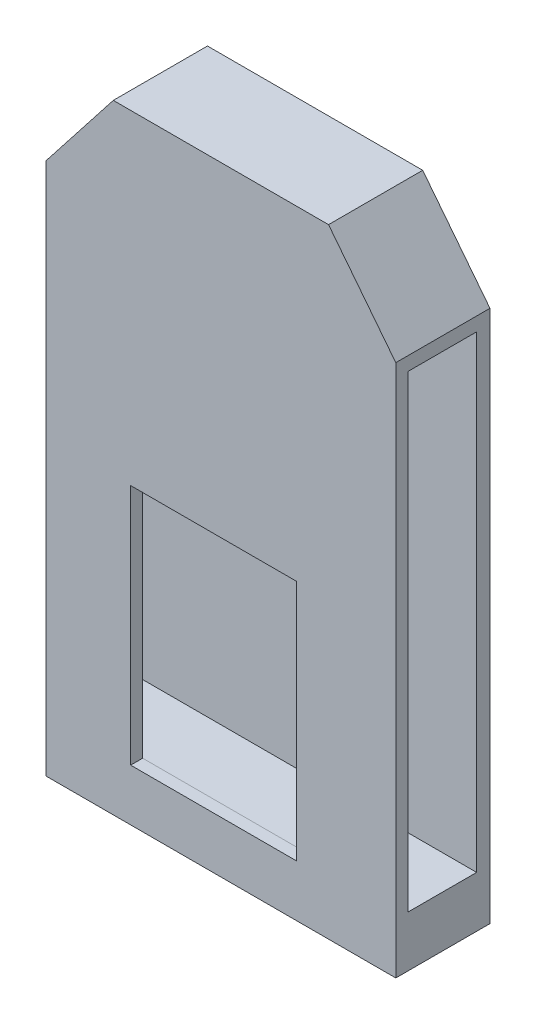
ISO-10303-21;
HEADER;
FILE_DESCRIPTION(('STEP AP214'),'2;1');
FILE_NAME('part.step','',(''),(''),'','','');
FILE_SCHEMA(('AUTOMOTIVE_DESIGN { 1 0 10303 214 1 1 1 1 }'));
ENDSEC;
DATA;
#1=APPLICATION_CONTEXT('core data for automotive mechanical design processes');
#2=APPLICATION_PROTOCOL_DEFINITION('international standard','automotive_design',2000,#1);
#3=PRODUCT_CONTEXT('',#1,'mechanical');
#4=PRODUCT('Part','Part','',(#3));
#5=PRODUCT_RELATED_PRODUCT_CATEGORY('part','',(#4));
#6=PRODUCT_DEFINITION_FORMATION('','',#4);
#7=PRODUCT_DEFINITION_CONTEXT('part definition',#1,'design');
#8=PRODUCT_DEFINITION('design','',#6,#7);
#9=PRODUCT_DEFINITION_SHAPE('','',#8);
#10=(LENGTH_UNIT() NAMED_UNIT(*) SI_UNIT(.MILLI.,.METRE.));
#11=(NAMED_UNIT(*) PLANE_ANGLE_UNIT() SI_UNIT($,.RADIAN.));
#12=(NAMED_UNIT(*) SI_UNIT($,.STERADIAN.) SOLID_ANGLE_UNIT());
#13=UNCERTAINTY_MEASURE_WITH_UNIT(LENGTH_MEASURE(1.E-05),#10,'distance_accuracy_value','');
#14=(GEOMETRIC_REPRESENTATION_CONTEXT(3) GLOBAL_UNCERTAINTY_ASSIGNED_CONTEXT((#13)) GLOBAL_UNIT_ASSIGNED_CONTEXT((#10,
#11,#12)) REPRESENTATION_CONTEXT('',''));
#15=CARTESIAN_POINT('',(0.,0.,0.));
#16=DIRECTION('',(0.,0.,1.));
#17=DIRECTION('',(1.,0.,0.));
#18=AXIS2_PLACEMENT_3D('',#15,#16,#17);
#19=CARTESIAN_POINT('',(130.,166.14,70.));
#20=DIRECTION('',(-0.787369688637585,-0.616481121701835,0.));
#21=DIRECTION('',(0.616481121701835,-0.787369688637585,0.));
#22=AXIS2_PLACEMENT_3D('',#19,#20,#21);
#23=PLANE('',#22);
#24=DIRECTION('',(-0.616481121701835,0.787369688637585,0.));
#25=VECTOR('',#24,1.);
#26=CARTESIAN_POINT('',(130.,166.14,0.));
#27=LINE('',#26,#25);
#28=CARTESIAN_POINT('',(130.,166.14,0.));
#29=VERTEX_POINT('',#28);
#30=CARTESIAN_POINT('',(80.,230.,0.));
#31=VERTEX_POINT('',#30);
#32=EDGE_CURVE('E317',#29,#31,#27,.T.);
#33=ORIENTED_EDGE('',*,*,#32,.T.);
#34=DIRECTION('',(0.,0.,-1.));
#35=VECTOR('',#34,1.);
#36=CARTESIAN_POINT('',(80.,230.,70.));
#37=LINE('',#36,#35);
#38=CARTESIAN_POINT('',(80.,230.,70.));
#39=VERTEX_POINT('',#38);
#40=EDGE_CURVE('E383',#39,#31,#37,.T.);
#41=ORIENTED_EDGE('',*,*,#40,.F.);
#42=DIRECTION('',(-0.616481121701835,0.787369688637585,0.));
#43=VECTOR('',#42,1.);
#44=CARTESIAN_POINT('',(130.,166.14,70.));
#45=LINE('',#44,#43);
#46=CARTESIAN_POINT('',(130.,166.14,70.));
#47=VERTEX_POINT('',#46);
#48=EDGE_CURVE('E326',#47,#39,#45,.T.);
#49=ORIENTED_EDGE('',*,*,#48,.F.);
#50=DIRECTION('',(0.,0.,-1.));
#51=VECTOR('',#50,1.);
#52=CARTESIAN_POINT('',(130.,166.14,70.));
#53=LINE('',#52,#51);
#54=EDGE_CURVE('E346',#47,#29,#53,.T.);
#55=ORIENTED_EDGE('',*,*,#54,.T.);
#56=EDGE_LOOP('',(#33,#41,#49,#55));
#57=FACE_BOUND('',#56,.T.);
#58=ADVANCED_FACE('F39',(#57),#23,.F.);
#59=CARTESIAN_POINT('',(80.,230.,70.));
#60=DIRECTION('',(0.,-1.,0.));
#61=DIRECTION('',(0.,0.,-1.));
#62=AXIS2_PLACEMENT_3D('',#59,#60,#61);
#63=PLANE('',#62);
#64=DIRECTION('',(-1.,0.,0.));
#65=VECTOR('',#64,1.);
#66=CARTESIAN_POINT('',(80.,230.,0.));
#67=LINE('',#66,#65);
#68=CARTESIAN_POINT('',(-80.,230.,0.));
#69=VERTEX_POINT('',#68);
#70=EDGE_CURVE('E350',#31,#69,#67,.T.);
#71=ORIENTED_EDGE('',*,*,#70,.T.);
#72=DIRECTION('',(0.,0.,-1.));
#73=VECTOR('',#72,1.);
#74=CARTESIAN_POINT('',(-80.,230.,70.));
#75=LINE('',#74,#73);
#76=CARTESIAN_POINT('',(-80.,230.,70.));
#77=VERTEX_POINT('',#76);
#78=EDGE_CURVE('E379',#77,#69,#75,.T.);
#79=ORIENTED_EDGE('',*,*,#78,.F.);
#80=DIRECTION('',(-1.,0.,0.));
#81=VECTOR('',#80,1.);
#82=CARTESIAN_POINT('',(80.,230.,70.));
#83=LINE('',#82,#81);
#84=EDGE_CURVE('E330',#39,#77,#83,.T.);
#85=ORIENTED_EDGE('',*,*,#84,.F.);
#86=ORIENTED_EDGE('',*,*,#40,.T.);
#87=EDGE_LOOP('',(#71,#79,#85,#86));
#88=FACE_BOUND('',#87,.T.);
#89=ADVANCED_FACE('F440',(#88),#63,.F.);
#90=CARTESIAN_POINT('',(-130.,166.14,70.));
#91=DIRECTION('',(0.787369688637585,-0.616481121701835,0.));
#92=DIRECTION('',(0.616481121701835,0.787369688637585,0.));
#93=AXIS2_PLACEMENT_3D('',#90,#91,#92);
#94=PLANE('',#93);
#95=DIRECTION('',(-0.616481121701835,-0.787369688637585,0.));
#96=VECTOR('',#95,1.);
#97=CARTESIAN_POINT('',(-130.,166.14,0.));
#98=LINE('',#97,#96);
#99=CARTESIAN_POINT('',(-130.,166.14,0.));
#100=VERTEX_POINT('',#99);
#101=EDGE_CURVE('E353',#69,#100,#98,.T.);
#102=ORIENTED_EDGE('',*,*,#101,.T.);
#103=DIRECTION('',(0.,0.,-1.));
#104=VECTOR('',#103,1.);
#105=CARTESIAN_POINT('',(-130.,166.14,70.));
#106=LINE('',#105,#104);
#107=CARTESIAN_POINT('',(-130.,166.14,70.));
#108=VERTEX_POINT('',#107);
#109=EDGE_CURVE('E375',#108,#100,#106,.T.);
#110=ORIENTED_EDGE('',*,*,#109,.F.);
#111=DIRECTION('',(-0.616481121701835,-0.787369688637585,0.));
#112=VECTOR('',#111,1.);
#113=CARTESIAN_POINT('',(-130.,166.14,70.));
#114=LINE('',#113,#112);
#115=EDGE_CURVE('E334',#77,#108,#114,.T.);
#116=ORIENTED_EDGE('',*,*,#115,.F.);
#117=ORIENTED_EDGE('',*,*,#78,.T.);
#118=EDGE_LOOP('',(#102,#110,#116,#117));
#119=FACE_BOUND('',#118,.T.);
#120=ADVANCED_FACE('F445',(#119),#94,.F.);
#121=CARTESIAN_POINT('',(-130.,-230.,70.));
#122=DIRECTION('',(1.,0.,0.));
#123=DIRECTION('',(0.,0.,-1.));
#124=AXIS2_PLACEMENT_3D('',#121,#122,#123);
#125=PLANE('',#124);
#126=DIRECTION('',(0.,0.,1.));
#127=VECTOR('',#126,1.);
#128=CARTESIAN_POINT('',(-130.,-192.07,9.89));
#129=LINE('',#128,#127);
#130=CARTESIAN_POINT('',(-130.,-192.07,9.89));
#131=VERTEX_POINT('',#130);
#132=CARTESIAN_POINT('',(-130.,-192.07,61.07));
#133=VERTEX_POINT('',#132);
#134=EDGE_CURVE('E210',#131,#133,#129,.T.);
#135=ORIENTED_EDGE('',*,*,#134,.F.);
#136=DIRECTION('',(0.,-1.,0.));
#137=VECTOR('',#136,1.);
#138=CARTESIAN_POINT('',(-130.,-192.07,9.89));
#139=LINE('',#138,#137);
#140=CARTESIAN_POINT('',(-130.,155.96,9.89));
#141=VERTEX_POINT('',#140);
#142=EDGE_CURVE('E54',#141,#131,#139,.T.);
#143=ORIENTED_EDGE('',*,*,#142,.F.);
#144=DIRECTION('',(0.,0.,-1.));
#145=VECTOR('',#144,1.);
#146=CARTESIAN_POINT('',(-130.,155.96,9.89));
#147=LINE('',#146,#145);
#148=CARTESIAN_POINT('',(-130.,155.96,61.07));
#149=VERTEX_POINT('',#148);
#150=EDGE_CURVE('E197',#149,#141,#147,.T.);
#151=ORIENTED_EDGE('',*,*,#150,.F.);
#152=DIRECTION('',(0.,1.,0.));
#153=VECTOR('',#152,1.);
#154=CARTESIAN_POINT('',(-130.,-192.07,61.07));
#155=LINE('',#154,#153);
#156=EDGE_CURVE('E201',#133,#149,#155,.T.);
#157=ORIENTED_EDGE('',*,*,#156,.F.);
#158=EDGE_LOOP('',(#135,#143,#151,#157));
#159=FACE_BOUND('',#158,.T.);
#160=DIRECTION('',(0.,-1.,0.));
#161=VECTOR('',#160,1.);
#162=CARTESIAN_POINT('',(-130.,-230.,0.));
#163=LINE('',#162,#161);
#164=CARTESIAN_POINT('',(-130.,-230.,0.));
#165=VERTEX_POINT('',#164);
#166=EDGE_CURVE('E356',#100,#165,#163,.T.);
#167=ORIENTED_EDGE('',*,*,#166,.T.);
#168=DIRECTION('',(0.,0.,-1.));
#169=VECTOR('',#168,1.);
#170=CARTESIAN_POINT('',(-130.,-230.,70.));
#171=LINE('',#170,#169);
#172=CARTESIAN_POINT('',(-130.,-230.,70.));
#173=VERTEX_POINT('',#172);
#174=EDGE_CURVE('E371',#173,#165,#171,.T.);
#175=ORIENTED_EDGE('',*,*,#174,.F.);
#176=DIRECTION('',(0.,-1.,0.));
#177=VECTOR('',#176,1.);
#178=CARTESIAN_POINT('',(-130.,-230.,70.));
#179=LINE('',#178,#177);
#180=EDGE_CURVE('E337',#108,#173,#179,.T.);
#181=ORIENTED_EDGE('',*,*,#180,.F.);
#182=ORIENTED_EDGE('',*,*,#109,.T.);
#183=EDGE_LOOP('',(#167,#175,#181,#182));
#184=FACE_BOUND('',#183,.T.);
#185=ADVANCED_FACE('F468',(#159,#184),#125,.F.);
#186=CARTESIAN_POINT('',(130.,-230.,70.));
#187=DIRECTION('',(0.,1.,0.));
#188=DIRECTION('',(0.,0.,1.));
#189=AXIS2_PLACEMENT_3D('',#186,#187,#188);
#190=PLANE('',#189);
#191=DIRECTION('',(1.,0.,0.));
#192=VECTOR('',#191,1.);
#193=CARTESIAN_POINT('',(130.,-230.,0.));
#194=LINE('',#193,#192);
#195=CARTESIAN_POINT('',(130.,-230.,0.));
#196=VERTEX_POINT('',#195);
#197=EDGE_CURVE('E359',#165,#196,#194,.T.);
#198=ORIENTED_EDGE('',*,*,#197,.T.);
#199=DIRECTION('',(0.,0.,-1.));
#200=VECTOR('',#199,1.);
#201=CARTESIAN_POINT('',(130.,-230.,70.));
#202=LINE('',#201,#200);
#203=CARTESIAN_POINT('',(130.,-230.,70.));
#204=VERTEX_POINT('',#203);
#205=EDGE_CURVE('E367',#204,#196,#202,.T.);
#206=ORIENTED_EDGE('',*,*,#205,.F.);
#207=DIRECTION('',(1.,0.,0.));
#208=VECTOR('',#207,1.);
#209=CARTESIAN_POINT('',(130.,-230.,70.));
#210=LINE('',#209,#208);
#211=EDGE_CURVE('E340',#173,#204,#210,.T.);
#212=ORIENTED_EDGE('',*,*,#211,.F.);
#213=ORIENTED_EDGE('',*,*,#174,.T.);
#214=EDGE_LOOP('',(#198,#206,#212,#213));
#215=FACE_BOUND('',#214,.T.);
#216=ADVANCED_FACE('F465',(#215),#190,.F.);
#217=CARTESIAN_POINT('',(130.,-230.,70.));
#218=DIRECTION('',(-1.,0.,0.));
#219=DIRECTION('',(0.,0.,1.));
#220=AXIS2_PLACEMENT_3D('',#217,#218,#219);
#221=PLANE('',#220);
#222=DIRECTION('',(0.,0.,-1.));
#223=VECTOR('',#222,1.);
#224=CARTESIAN_POINT('',(130.,155.96,9.89));
#225=LINE('',#224,#223);
#226=CARTESIAN_POINT('',(130.,155.96,61.07));
#227=VERTEX_POINT('',#226);
#228=CARTESIAN_POINT('',(130.,155.96,9.89));
#229=VERTEX_POINT('',#228);
#230=EDGE_CURVE('E185',#227,#229,#225,.T.);
#231=ORIENTED_EDGE('',*,*,#230,.T.);
#232=DIRECTION('',(0.,-1.,0.));
#233=VECTOR('',#232,1.);
#234=CARTESIAN_POINT('',(130.,-192.07,9.89));
#235=LINE('',#234,#233);
#236=CARTESIAN_POINT('',(130.,-192.07,9.89));
#237=VERTEX_POINT('',#236);
#238=EDGE_CURVE('E178',#229,#237,#235,.T.);
#239=ORIENTED_EDGE('',*,*,#238,.T.);
#240=DIRECTION('',(0.,0.,1.));
#241=VECTOR('',#240,1.);
#242=CARTESIAN_POINT('',(130.,-192.07,9.89));
#243=LINE('',#242,#241);
#244=CARTESIAN_POINT('',(130.,-192.07,61.07));
#245=VERTEX_POINT('',#244);
#246=EDGE_CURVE('E188',#237,#245,#243,.T.);
#247=ORIENTED_EDGE('',*,*,#246,.T.);
#248=DIRECTION('',(0.,1.,0.));
#249=VECTOR('',#248,1.);
#250=CARTESIAN_POINT('',(130.,-192.07,61.07));
#251=LINE('',#250,#249);
#252=EDGE_CURVE('E62',#245,#227,#251,.T.);
#253=ORIENTED_EDGE('',*,*,#252,.T.);
#254=EDGE_LOOP('',(#231,#239,#247,#253));
#255=FACE_BOUND('',#254,.T.);
#256=DIRECTION('',(0.,1.,0.));
#257=VECTOR('',#256,1.);
#258=CARTESIAN_POINT('',(130.,-230.,0.));
#259=LINE('',#258,#257);
#260=EDGE_CURVE('E331',#196,#29,#259,.T.);
#261=ORIENTED_EDGE('',*,*,#260,.T.);
#262=ORIENTED_EDGE('',*,*,#54,.F.);
#263=DIRECTION('',(0.,1.,0.));
#264=VECTOR('',#263,1.);
#265=CARTESIAN_POINT('',(130.,-230.,70.));
#266=LINE('',#265,#264);
#267=EDGE_CURVE('E343',#204,#47,#266,.T.);
#268=ORIENTED_EDGE('',*,*,#267,.F.);
#269=ORIENTED_EDGE('',*,*,#205,.T.);
#270=EDGE_LOOP('',(#261,#262,#268,#269));
#271=FACE_BOUND('',#270,.T.);
#272=ADVANCED_FACE('F193',(#255,#271),#221,.F.);
#273=CARTESIAN_POINT('',(0.,0.,70.));
#274=DIRECTION('',(0.,0.,-1.));
#275=DIRECTION('',(-1.,0.,0.));
#276=AXIS2_PLACEMENT_3D('',#273,#274,#275);
#277=PLANE('',#276);
#278=DIRECTION('',(1.,0.,0.));
#279=VECTOR('',#278,1.);
#280=CARTESIAN_POINT('',(-67.1,-191.52,70.));
#281=LINE('',#280,#279);
#282=CARTESIAN_POINT('',(-67.1,-191.52,70.));
#283=VERTEX_POINT('',#282);
#284=CARTESIAN_POINT('',(56.15,-191.52,70.));
#285=VERTEX_POINT('',#284);
#286=EDGE_CURVE('E301',#283,#285,#281,.T.);
#287=ORIENTED_EDGE('',*,*,#286,.F.);
#288=DIRECTION('',(0.,-1.,0.));
#289=VECTOR('',#288,1.);
#290=CARTESIAN_POINT('',(-67.1,-191.52,70.));
#291=LINE('',#290,#289);
#292=CARTESIAN_POINT('',(-67.1,-11.52,70.));
#293=VERTEX_POINT('',#292);
#294=EDGE_CURVE('E286',#293,#283,#291,.T.);
#295=ORIENTED_EDGE('',*,*,#294,.F.);
#296=DIRECTION('',(-1.,0.,0.));
#297=VECTOR('',#296,1.);
#298=CARTESIAN_POINT('',(-67.1,-11.52,70.));
#299=LINE('',#298,#297);
#300=CARTESIAN_POINT('',(56.15,-11.52,70.));
#301=VERTEX_POINT('',#300);
#302=EDGE_CURVE('E309',#301,#293,#299,.T.);
#303=ORIENTED_EDGE('',*,*,#302,.F.);
#304=DIRECTION('',(0.,1.,0.));
#305=VECTOR('',#304,1.);
#306=CARTESIAN_POINT('',(56.15,-191.52,70.));
#307=LINE('',#306,#305);
#308=EDGE_CURVE('E305',#285,#301,#307,.T.);
#309=ORIENTED_EDGE('',*,*,#308,.F.);
#310=EDGE_LOOP('',(#287,#295,#303,#309));
#311=FACE_BOUND('',#310,.T.);
#312=ORIENTED_EDGE('',*,*,#48,.T.);
#313=ORIENTED_EDGE('',*,*,#84,.T.);
#314=ORIENTED_EDGE('',*,*,#115,.T.);
#315=ORIENTED_EDGE('',*,*,#180,.T.);
#316=ORIENTED_EDGE('',*,*,#211,.T.);
#317=ORIENTED_EDGE('',*,*,#267,.T.);
#318=EDGE_LOOP('',(#312,#313,#314,#315,#316,#317));
#319=FACE_BOUND('',#318,.T.);
#320=ADVANCED_FACE('F460',(#311,#319),#277,.F.);
#321=CARTESIAN_POINT('',(0.,0.,0.));
#322=DIRECTION('',(0.,0.,-1.));
#323=DIRECTION('',(-1.,0.,0.));
#324=AXIS2_PLACEMENT_3D('',#321,#322,#323);
#325=PLANE('',#324);
#326=ORIENTED_EDGE('',*,*,#32,.F.);
#327=ORIENTED_EDGE('',*,*,#260,.F.);
#328=ORIENTED_EDGE('',*,*,#197,.F.);
#329=ORIENTED_EDGE('',*,*,#166,.F.);
#330=ORIENTED_EDGE('',*,*,#101,.F.);
#331=ORIENTED_EDGE('',*,*,#70,.F.);
#332=EDGE_LOOP('',(#326,#327,#328,#329,#330,#331));
#333=FACE_BOUND('',#332,.T.);
#334=ADVANCED_FACE('F453',(#333),#325,.T.);
#335=CARTESIAN_POINT('',(-67.1,-191.52,10.));
#336=DIRECTION('',(-1.,0.,0.));
#337=DIRECTION('',(0.,0.,1.));
#338=AXIS2_PLACEMENT_3D('',#335,#336,#337);
#339=PLANE('',#338);
#340=DIRECTION('',(0.,0.,1.));
#341=VECTOR('',#340,1.);
#342=CARTESIAN_POINT('',(-67.1,-191.52,10.));
#343=LINE('',#342,#341);
#344=CARTESIAN_POINT('',(-67.1,-191.52,61.07));
#345=VERTEX_POINT('',#344);
#346=EDGE_CURVE('E313',#345,#283,#343,.T.);
#347=ORIENTED_EDGE('',*,*,#346,.F.);
#348=DIRECTION('',(0.,1.,0.));
#349=VECTOR('',#348,1.);
#350=CARTESIAN_POINT('',(-67.1,-191.52,61.07));
#351=LINE('',#350,#349);
#352=CARTESIAN_POINT('',(-67.1,-11.52,61.07));
#353=VERTEX_POINT('',#352);
#354=EDGE_CURVE('E247',#345,#353,#351,.T.);
#355=ORIENTED_EDGE('',*,*,#354,.T.);
#356=DIRECTION('',(0.,0.,1.));
#357=VECTOR('',#356,1.);
#358=CARTESIAN_POINT('',(-67.1,-11.52,10.));
#359=LINE('',#358,#357);
#360=EDGE_CURVE('E314',#353,#293,#359,.T.);
#361=ORIENTED_EDGE('',*,*,#360,.T.);
#362=ORIENTED_EDGE('',*,*,#294,.T.);
#363=EDGE_LOOP('',(#347,#355,#361,#362));
#364=FACE_BOUND('',#363,.T.);
#365=ADVANCED_FACE('F416',(#364),#339,.F.);
#366=CARTESIAN_POINT('',(-67.1,-11.52,10.));
#367=DIRECTION('',(0.,1.,0.));
#368=DIRECTION('',(0.,0.,1.));
#369=AXIS2_PLACEMENT_3D('',#366,#367,#368);
#370=PLANE('',#369);
#371=ORIENTED_EDGE('',*,*,#360,.F.);
#372=DIRECTION('',(1.,0.,0.));
#373=VECTOR('',#372,1.);
#374=CARTESIAN_POINT('',(-67.1,-11.52,61.07));
#375=LINE('',#374,#373);
#376=CARTESIAN_POINT('',(-63.6054596,-11.52,61.07));
#377=VERTEX_POINT('',#376);
#378=EDGE_CURVE('E239',#353,#377,#375,.T.);
#379=ORIENTED_EDGE('',*,*,#378,.T.);
#380=DIRECTION('',(0.,0.,-1.));
#381=VECTOR('',#380,1.);
#382=CARTESIAN_POINT('',(-63.6054596,-11.52,67.48023271));
#383=LINE('',#382,#381);
#384=CARTESIAN_POINT('',(-63.6054596,-11.52,67.48023271));
#385=VERTEX_POINT('',#384);
#386=EDGE_CURVE('E255',#385,#377,#383,.T.);
#387=ORIENTED_EDGE('',*,*,#386,.F.);
#388=DIRECTION('',(-1.,0.,0.));
#389=VECTOR('',#388,1.);
#390=CARTESIAN_POINT('',(52.6554596,-11.52,67.48023271));
#391=LINE('',#390,#389);
#392=CARTESIAN_POINT('',(52.6554596,-11.52,67.48023271));
#393=VERTEX_POINT('',#392);
#394=EDGE_CURVE('E261',#393,#385,#391,.T.);
#395=ORIENTED_EDGE('',*,*,#394,.F.);
#396=DIRECTION('',(0.,0.,1.));
#397=VECTOR('',#396,1.);
#398=CARTESIAN_POINT('',(52.6554596,-11.52,67.48023271));
#399=LINE('',#398,#397);
#400=CARTESIAN_POINT('',(52.6554596,-11.52,61.07));
#401=VERTEX_POINT('',#400);
#402=EDGE_CURVE('E277',#401,#393,#399,.T.);
#403=ORIENTED_EDGE('',*,*,#402,.F.);
#404=CARTESIAN_POINT('',(56.15,-11.52,61.07));
#405=VERTEX_POINT('',#404);
#406=EDGE_CURVE('E234',#401,#405,#375,.T.);
#407=ORIENTED_EDGE('',*,*,#406,.T.);
#408=DIRECTION('',(0.,0.,1.));
#409=VECTOR('',#408,1.);
#410=CARTESIAN_POINT('',(56.15,-11.52,10.));
#411=LINE('',#410,#409);
#412=EDGE_CURVE('E318',#405,#301,#411,.T.);
#413=ORIENTED_EDGE('',*,*,#412,.T.);
#414=ORIENTED_EDGE('',*,*,#302,.T.);
#415=EDGE_LOOP('',(#371,#379,#387,#395,#403,#407,#413,#414));
#416=FACE_BOUND('',#415,.T.);
#417=ADVANCED_FACE('F412',(#416),#370,.F.);
#418=CARTESIAN_POINT('',(56.15,-191.52,10.));
#419=DIRECTION('',(1.,0.,0.));
#420=DIRECTION('',(0.,0.,-1.));
#421=AXIS2_PLACEMENT_3D('',#418,#419,#420);
#422=PLANE('',#421);
#423=ORIENTED_EDGE('',*,*,#412,.F.);
#424=DIRECTION('',(0.,-1.,0.));
#425=VECTOR('',#424,1.);
#426=CARTESIAN_POINT('',(56.15,-191.52,61.07));
#427=LINE('',#426,#425);
#428=CARTESIAN_POINT('',(56.15,-191.52,61.07));
#429=VERTEX_POINT('',#428);
#430=EDGE_CURVE('E238',#405,#429,#427,.T.);
#431=ORIENTED_EDGE('',*,*,#430,.T.);
#432=DIRECTION('',(0.,0.,1.));
#433=VECTOR('',#432,1.);
#434=CARTESIAN_POINT('',(56.15,-191.52,10.));
#435=LINE('',#434,#433);
#436=EDGE_CURVE('E321',#429,#285,#435,.T.);
#437=ORIENTED_EDGE('',*,*,#436,.T.);
#438=ORIENTED_EDGE('',*,*,#308,.T.);
#439=EDGE_LOOP('',(#423,#431,#437,#438));
#440=FACE_BOUND('',#439,.T.);
#441=ADVANCED_FACE('F425',(#440),#422,.F.);
#442=CARTESIAN_POINT('',(-67.1,-191.52,10.));
#443=DIRECTION('',(0.,-1.,0.));
#444=DIRECTION('',(0.,0.,-1.));
#445=AXIS2_PLACEMENT_3D('',#442,#443,#444);
#446=PLANE('',#445);
#447=ORIENTED_EDGE('',*,*,#436,.F.);
#448=DIRECTION('',(-1.,0.,0.));
#449=VECTOR('',#448,1.);
#450=CARTESIAN_POINT('',(-67.1,-191.52,61.07));
#451=LINE('',#450,#449);
#452=EDGE_CURVE('E243',#429,#345,#451,.T.);
#453=ORIENTED_EDGE('',*,*,#452,.T.);
#454=ORIENTED_EDGE('',*,*,#346,.T.);
#455=ORIENTED_EDGE('',*,*,#286,.T.);
#456=EDGE_LOOP('',(#447,#453,#454,#455));
#457=FACE_BOUND('',#456,.T.);
#458=ADVANCED_FACE('F421',(#457),#446,.F.);
#459=CARTESIAN_POINT('',(-63.6054596,220.48,67.48023271));
#460=DIRECTION('',(-1.,0.,0.));
#461=DIRECTION('',(0.,0.,1.));
#462=AXIS2_PLACEMENT_3D('',#459,#460,#461);
#463=PLANE('',#462);
#464=DIRECTION('',(0.,1.,0.));
#465=VECTOR('',#464,1.);
#466=CARTESIAN_POINT('',(-63.6054596,220.48,61.07));
#467=LINE('',#466,#465);
#468=CARTESIAN_POINT('',(-63.6054596,155.96,61.07));
#469=VERTEX_POINT('',#468);
#470=EDGE_CURVE('E251',#377,#469,#467,.T.);
#471=ORIENTED_EDGE('',*,*,#470,.T.);
#472=DIRECTION('',(0.,0.,-1.));
#473=VECTOR('',#472,1.);
#474=CARTESIAN_POINT('',(-63.6054596,155.96,67.48023271));
#475=LINE('',#474,#473);
#476=CARTESIAN_POINT('',(-63.6054596,155.96,12.51976729));
#477=VERTEX_POINT('',#476);
#478=EDGE_CURVE('E230',#469,#477,#475,.T.);
#479=ORIENTED_EDGE('',*,*,#478,.T.);
#480=DIRECTION('',(0.,-1.,0.));
#481=VECTOR('',#480,1.);
#482=CARTESIAN_POINT('',(-63.6054596,220.48,12.51976729));
#483=LINE('',#482,#481);
#484=CARTESIAN_POINT('',(-63.6054596,220.48,12.51976729));
#485=VERTEX_POINT('',#484);
#486=EDGE_CURVE('E273',#485,#477,#483,.T.);
#487=ORIENTED_EDGE('',*,*,#486,.F.);
#488=DIRECTION('',(0.,0.,-1.));
#489=VECTOR('',#488,1.);
#490=CARTESIAN_POINT('',(-63.6054596,220.48,67.48023271));
#491=LINE('',#490,#489);
#492=CARTESIAN_POINT('',(-63.6054596,220.48,67.48023271));
#493=VERTEX_POINT('',#492);
#494=EDGE_CURVE('E256',#493,#485,#491,.T.);
#495=ORIENTED_EDGE('',*,*,#494,.F.);
#496=DIRECTION('',(0.,-1.,0.));
#497=VECTOR('',#496,1.);
#498=CARTESIAN_POINT('',(-63.6054596,220.48,67.48023271));
#499=LINE('',#498,#497);
#500=EDGE_CURVE('E283',#493,#385,#499,.T.);
#501=ORIENTED_EDGE('',*,*,#500,.T.);
#502=ORIENTED_EDGE('',*,*,#386,.T.);
#503=EDGE_LOOP('',(#471,#479,#487,#495,#501,#502));
#504=FACE_BOUND('',#503,.T.);
#505=ADVANCED_FACE('F400',(#504),#463,.F.);
#506=CARTESIAN_POINT('',(52.6554596,220.48,67.48023271));
#507=DIRECTION('',(0.,0.,1.));
#508=DIRECTION('',(1.,0.,0.));
#509=AXIS2_PLACEMENT_3D('',#506,#507,#508);
#510=PLANE('',#509);
#511=ORIENTED_EDGE('',*,*,#394,.T.);
#512=ORIENTED_EDGE('',*,*,#500,.F.);
#513=DIRECTION('',(-1.,0.,0.));
#514=VECTOR('',#513,1.);
#515=CARTESIAN_POINT('',(52.6554596,220.48,67.48023271));
#516=LINE('',#515,#514);
#517=CARTESIAN_POINT('',(52.6554596,220.48,67.48023271));
#518=VERTEX_POINT('',#517);
#519=EDGE_CURVE('E269',#518,#493,#516,.T.);
#520=ORIENTED_EDGE('',*,*,#519,.F.);
#521=DIRECTION('',(0.,-1.,0.));
#522=VECTOR('',#521,1.);
#523=CARTESIAN_POINT('',(52.6554596,220.48,67.48023271));
#524=LINE('',#523,#522);
#525=EDGE_CURVE('E287',#518,#393,#524,.T.);
#526=ORIENTED_EDGE('',*,*,#525,.T.);
#527=EDGE_LOOP('',(#511,#512,#520,#526));
#528=FACE_BOUND('',#527,.T.);
#529=ADVANCED_FACE('F429',(#528),#510,.F.);
#530=CARTESIAN_POINT('',(52.6554596,220.48,67.48023271));
#531=DIRECTION('',(1.,0.,0.));
#532=DIRECTION('',(0.,0.,-1.));
#533=AXIS2_PLACEMENT_3D('',#530,#531,#532);
#534=PLANE('',#533);
#535=DIRECTION('',(0.,-1.,0.));
#536=VECTOR('',#535,1.);
#537=CARTESIAN_POINT('',(52.6554596,220.48,12.51976729));
#538=LINE('',#537,#536);
#539=CARTESIAN_POINT('',(52.6554596,220.48,12.51976729));
#540=VERTEX_POINT('',#539);
#541=CARTESIAN_POINT('',(52.6554596,155.96,12.51976729));
#542=VERTEX_POINT('',#541);
#543=EDGE_CURVE('E291',#540,#542,#538,.T.);
#544=ORIENTED_EDGE('',*,*,#543,.T.);
#545=DIRECTION('',(0.,0.,1.));
#546=VECTOR('',#545,1.);
#547=CARTESIAN_POINT('',(52.6554596,155.96,67.48023271));
#548=LINE('',#547,#546);
#549=CARTESIAN_POINT('',(52.6554596,155.96,61.07));
#550=VERTEX_POINT('',#549);
#551=EDGE_CURVE('E219',#542,#550,#548,.T.);
#552=ORIENTED_EDGE('',*,*,#551,.T.);
#553=DIRECTION('',(0.,-1.,0.));
#554=VECTOR('',#553,1.);
#555=CARTESIAN_POINT('',(52.6554596,220.48,61.07));
#556=LINE('',#555,#554);
#557=EDGE_CURVE('E11',#550,#401,#556,.T.);
#558=ORIENTED_EDGE('',*,*,#557,.T.);
#559=ORIENTED_EDGE('',*,*,#402,.T.);
#560=ORIENTED_EDGE('',*,*,#525,.F.);
#561=DIRECTION('',(0.,0.,1.));
#562=VECTOR('',#561,1.);
#563=CARTESIAN_POINT('',(52.6554596,220.48,67.48023271));
#564=LINE('',#563,#562);
#565=EDGE_CURVE('E265',#540,#518,#564,.T.);
#566=ORIENTED_EDGE('',*,*,#565,.F.);
#567=EDGE_LOOP('',(#544,#552,#558,#559,#560,#566));
#568=FACE_BOUND('',#567,.T.);
#569=ADVANCED_FACE('F394',(#568),#534,.F.);
#570=CARTESIAN_POINT('',(52.6554596,220.48,12.51976729));
#571=DIRECTION('',(0.,0.,-1.));
#572=DIRECTION('',(-1.,0.,0.));
#573=AXIS2_PLACEMENT_3D('',#570,#571,#572);
#574=PLANE('',#573);
#575=ORIENTED_EDGE('',*,*,#486,.T.);
#576=DIRECTION('',(1.,0.,0.));
#577=VECTOR('',#576,1.);
#578=CARTESIAN_POINT('',(52.6554596,155.96,12.51976729));
#579=LINE('',#578,#577);
#580=EDGE_CURVE('E47',#477,#542,#579,.T.);
#581=ORIENTED_EDGE('',*,*,#580,.T.);
#582=ORIENTED_EDGE('',*,*,#543,.F.);
#583=DIRECTION('',(1.,0.,0.));
#584=VECTOR('',#583,1.);
#585=CARTESIAN_POINT('',(52.6554596,220.48,12.51976729));
#586=LINE('',#585,#584);
#587=EDGE_CURVE('E260',#485,#540,#586,.T.);
#588=ORIENTED_EDGE('',*,*,#587,.F.);
#589=EDGE_LOOP('',(#575,#581,#582,#588));
#590=FACE_BOUND('',#589,.T.);
#591=ADVANCED_FACE('F389',(#590),#574,.F.);
#592=CARTESIAN_POINT('',(0.,220.48,0.));
#593=DIRECTION('',(0.,1.,0.));
#594=DIRECTION('',(0.,0.,1.));
#595=AXIS2_PLACEMENT_3D('',#592,#593,#594);
#596=PLANE('',#595);
#597=ORIENTED_EDGE('',*,*,#494,.T.);
#598=ORIENTED_EDGE('',*,*,#587,.T.);
#599=ORIENTED_EDGE('',*,*,#565,.T.);
#600=ORIENTED_EDGE('',*,*,#519,.T.);
#601=EDGE_LOOP('',(#597,#598,#599,#600));
#602=FACE_BOUND('',#601,.T.);
#603=ADVANCED_FACE('F397',(#602),#596,.F.);
#604=CARTESIAN_POINT('',(130.,-192.07,61.07));
#605=DIRECTION('',(0.,0.,1.));
#606=DIRECTION('',(1.,0.,0.));
#607=AXIS2_PLACEMENT_3D('',#604,#605,#606);
#608=PLANE('',#607);
#609=ORIENTED_EDGE('',*,*,#378,.F.);
#610=ORIENTED_EDGE('',*,*,#354,.F.);
#611=ORIENTED_EDGE('',*,*,#452,.F.);
#612=ORIENTED_EDGE('',*,*,#430,.F.);
#613=ORIENTED_EDGE('',*,*,#406,.F.);
#614=ORIENTED_EDGE('',*,*,#557,.F.);
#615=DIRECTION('',(-1.,0.,0.));
#616=VECTOR('',#615,1.);
#617=CARTESIAN_POINT('',(130.,155.96,61.07));
#618=LINE('',#617,#616);
#619=EDGE_CURVE('E220',#227,#550,#618,.T.);
#620=ORIENTED_EDGE('',*,*,#619,.F.);
#621=ORIENTED_EDGE('',*,*,#252,.F.);
#622=DIRECTION('',(-1.,0.,0.));
#623=VECTOR('',#622,1.);
#624=CARTESIAN_POINT('',(130.,-192.07,61.07));
#625=LINE('',#624,#623);
#626=EDGE_CURVE('E184',#245,#133,#625,.T.);
#627=ORIENTED_EDGE('',*,*,#626,.T.);
#628=ORIENTED_EDGE('',*,*,#156,.T.);
#629=EDGE_CURVE('E224',#469,#149,#618,.T.);
#630=ORIENTED_EDGE('',*,*,#629,.F.);
#631=ORIENTED_EDGE('',*,*,#470,.F.);
#632=EDGE_LOOP('',(#609,#610,#611,#612,#613,#614,#620,#621,#627,#628,#630,#631));
#633=FACE_BOUND('',#632,.T.);
#634=ADVANCED_FACE('F403',(#633),#608,.F.);
#635=CARTESIAN_POINT('',(130.,155.96,9.89));
#636=DIRECTION('',(0.,1.,0.));
#637=DIRECTION('',(0.,0.,1.));
#638=AXIS2_PLACEMENT_3D('',#635,#636,#637);
#639=PLANE('',#638);
#640=ORIENTED_EDGE('',*,*,#629,.T.);
#641=ORIENTED_EDGE('',*,*,#150,.T.);
#642=DIRECTION('',(-1.,0.,0.));
#643=VECTOR('',#642,1.);
#644=CARTESIAN_POINT('',(130.,155.96,9.89));
#645=LINE('',#644,#643);
#646=EDGE_CURVE('E216',#229,#141,#645,.T.);
#647=ORIENTED_EDGE('',*,*,#646,.F.);
#648=ORIENTED_EDGE('',*,*,#230,.F.);
#649=ORIENTED_EDGE('',*,*,#619,.T.);
#650=ORIENTED_EDGE('',*,*,#551,.F.);
#651=ORIENTED_EDGE('',*,*,#580,.F.);
#652=ORIENTED_EDGE('',*,*,#478,.F.);
#653=EDGE_LOOP('',(#640,#641,#647,#648,#649,#650,#651,#652));
#654=FACE_BOUND('',#653,.T.);
#655=ADVANCED_FACE('F402',(#654),#639,.F.);
#656=CARTESIAN_POINT('',(130.,-192.07,9.89));
#657=DIRECTION('',(0.,0.,-1.));
#658=DIRECTION('',(-1.,0.,0.));
#659=AXIS2_PLACEMENT_3D('',#656,#657,#658);
#660=PLANE('',#659);
#661=ORIENTED_EDGE('',*,*,#142,.T.);
#662=DIRECTION('',(-1.,0.,0.));
#663=VECTOR('',#662,1.);
#664=CARTESIAN_POINT('',(130.,-192.07,9.89));
#665=LINE('',#664,#663);
#666=EDGE_CURVE('E174',#237,#131,#665,.T.);
#667=ORIENTED_EDGE('',*,*,#666,.F.);
#668=ORIENTED_EDGE('',*,*,#238,.F.);
#669=ORIENTED_EDGE('',*,*,#646,.T.);
#670=EDGE_LOOP('',(#661,#667,#668,#669));
#671=FACE_BOUND('',#670,.T.);
#672=ADVANCED_FACE('F176',(#671),#660,.F.);
#673=CARTESIAN_POINT('',(130.,-192.07,9.89));
#674=DIRECTION('',(0.,-1.,0.));
#675=DIRECTION('',(0.,0.,-1.));
#676=AXIS2_PLACEMENT_3D('',#673,#674,#675);
#677=PLANE('',#676);
#678=ORIENTED_EDGE('',*,*,#134,.T.);
#679=ORIENTED_EDGE('',*,*,#626,.F.);
#680=ORIENTED_EDGE('',*,*,#246,.F.);
#681=ORIENTED_EDGE('',*,*,#666,.T.);
#682=EDGE_LOOP('',(#678,#679,#680,#681));
#683=FACE_BOUND('',#682,.T.);
#684=ADVANCED_FACE('F189',(#683),#677,.F.);
#685=CLOSED_SHELL('',(#58,#89,#120,#185,#216,#272,#320,#334,#365,#417,#441,#458,#505,#529,#569,
#591,#603,#634,#655,#672,#684));
#686=MANIFOLD_SOLID_BREP('B2',#685);
#687=ADVANCED_BREP_SHAPE_REPRESENTATION('',(#18,#686),#14);
#688=SHAPE_DEFINITION_REPRESENTATION(#9,#687);
ENDSEC;
END-ISO-10303-21;
